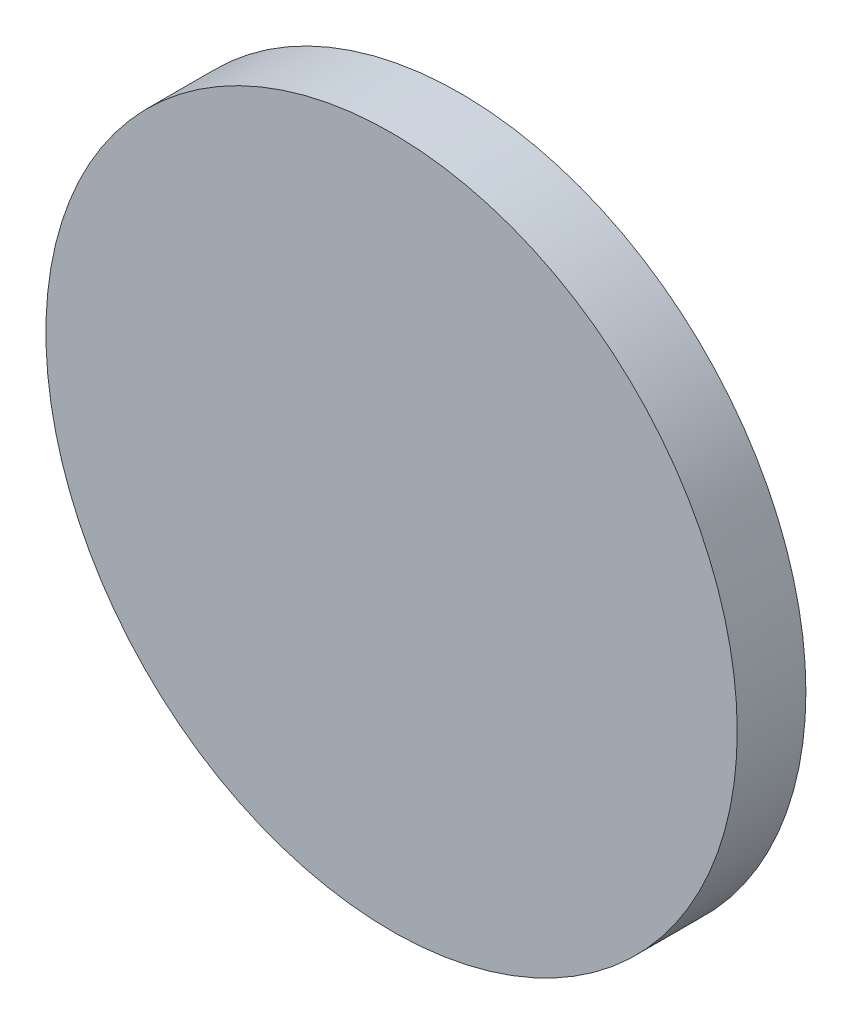
ISO-10303-21;
HEADER;
FILE_DESCRIPTION(('STEP AP214'),'2;1');
FILE_NAME('part.step','',(''),(''),'','','');
FILE_SCHEMA(('AUTOMOTIVE_DESIGN { 1 0 10303 214 1 1 1 1 }'));
ENDSEC;
DATA;
#1=APPLICATION_CONTEXT('core data for automotive mechanical design processes');
#2=APPLICATION_PROTOCOL_DEFINITION('international standard','automotive_design',2000,#1);
#3=PRODUCT_CONTEXT('',#1,'mechanical');
#4=PRODUCT('Part','Part','',(#3));
#5=PRODUCT_RELATED_PRODUCT_CATEGORY('part','',(#4));
#6=PRODUCT_DEFINITION_FORMATION('','',#4);
#7=PRODUCT_DEFINITION_CONTEXT('part definition',#1,'design');
#8=PRODUCT_DEFINITION('design','',#6,#7);
#9=PRODUCT_DEFINITION_SHAPE('','',#8);
#10=(LENGTH_UNIT() NAMED_UNIT(*) SI_UNIT(.MILLI.,.METRE.));
#11=(NAMED_UNIT(*) PLANE_ANGLE_UNIT() SI_UNIT($,.RADIAN.));
#12=(NAMED_UNIT(*) SI_UNIT($,.STERADIAN.) SOLID_ANGLE_UNIT());
#13=UNCERTAINTY_MEASURE_WITH_UNIT(LENGTH_MEASURE(1.E-05),#10,'distance_accuracy_value','');
#14=(GEOMETRIC_REPRESENTATION_CONTEXT(3) GLOBAL_UNCERTAINTY_ASSIGNED_CONTEXT((#13)) GLOBAL_UNIT_ASSIGNED_CONTEXT((#10,
#11,#12)) REPRESENTATION_CONTEXT('',''));
#15=CARTESIAN_POINT('',(0.,0.,0.));
#16=DIRECTION('',(0.,0.,1.));
#17=DIRECTION('',(1.,0.,0.));
#18=AXIS2_PLACEMENT_3D('',#15,#16,#17);
#19=CARTESIAN_POINT('',(0.,0.,0.));
#20=DIRECTION('',(0.,0.,1.));
#21=DIRECTION('',(1.,0.,0.));
#22=AXIS2_PLACEMENT_3D('',#19,#20,#21);
#23=PLANE('',#22);
#24=CARTESIAN_POINT('',(0.,0.,0.));
#25=DIRECTION('',(0.,0.,1.));
#26=DIRECTION('',(1.,0.,0.));
#27=AXIS2_PLACEMENT_3D('',#24,#25,#26);
#28=CIRCLE('',#27,10.);
#29=CARTESIAN_POINT('',(10.,0.,0.));
#30=VERTEX_POINT('',#29);
#31=EDGE_CURVE('E10',#30,#30,#28,.T.);
#32=ORIENTED_EDGE('',*,*,#31,.T.);
#33=EDGE_LOOP('',(#32));
#34=FACE_BOUND('',#33,.T.);
#35=ADVANCED_FACE('F37',(#34),#23,.T.);
#36=CARTESIAN_POINT('',(0.,0.,-1.98657340030244));
#37=DIRECTION('',(0.,0.,1.));
#38=DIRECTION('',(1.,0.,0.));
#39=AXIS2_PLACEMENT_3D('',#36,#37,#38);
#40=CYLINDRICAL_SURFACE('',#39,10.);
#41=CARTESIAN_POINT('',(0.,0.,-1.98657340030245));
#42=DIRECTION('',(0.,0.,1.));
#43=DIRECTION('',(1.,0.,0.));
#44=AXIS2_PLACEMENT_3D('',#41,#42,#43);
#45=CIRCLE('',#44,10.);
#46=CARTESIAN_POINT('',(10.,0.,-1.98657340030245));
#47=VERTEX_POINT('',#46);
#48=EDGE_CURVE('E43',#47,#47,#45,.T.);
#49=ORIENTED_EDGE('',*,*,#48,.T.);
#50=EDGE_LOOP('',(#49));
#51=FACE_BOUND('',#50,.T.);
#52=ORIENTED_EDGE('',*,*,#31,.F.);
#53=EDGE_LOOP('',(#52));
#54=FACE_BOUND('',#53,.T.);
#55=ADVANCED_FACE('F49',(#51,#54),#40,.T.);
#56=CARTESIAN_POINT('',(0.,0.,21.84));
#57=DIRECTION('',(0.,0.,1.));
#58=DIRECTION('',(1.,0.,0.));
#59=AXIS2_PLACEMENT_3D('',#56,#57,#58);
#60=SPHERICAL_SURFACE('',#59,25.84);
#61=ORIENTED_EDGE('',*,*,#48,.F.);
#62=EDGE_LOOP('',(#61));
#63=FACE_BOUND('',#62,.T.);
#64=ADVANCED_FACE('F52',(#63),#60,.T.);
#65=CLOSED_SHELL('',(#35,#55,#64));
#66=MANIFOLD_SOLID_BREP('B2',#65);
#67=ADVANCED_BREP_SHAPE_REPRESENTATION('',(#18,#66),#14);
#68=SHAPE_DEFINITION_REPRESENTATION(#9,#67);
ENDSEC;
END-ISO-10303-21;
